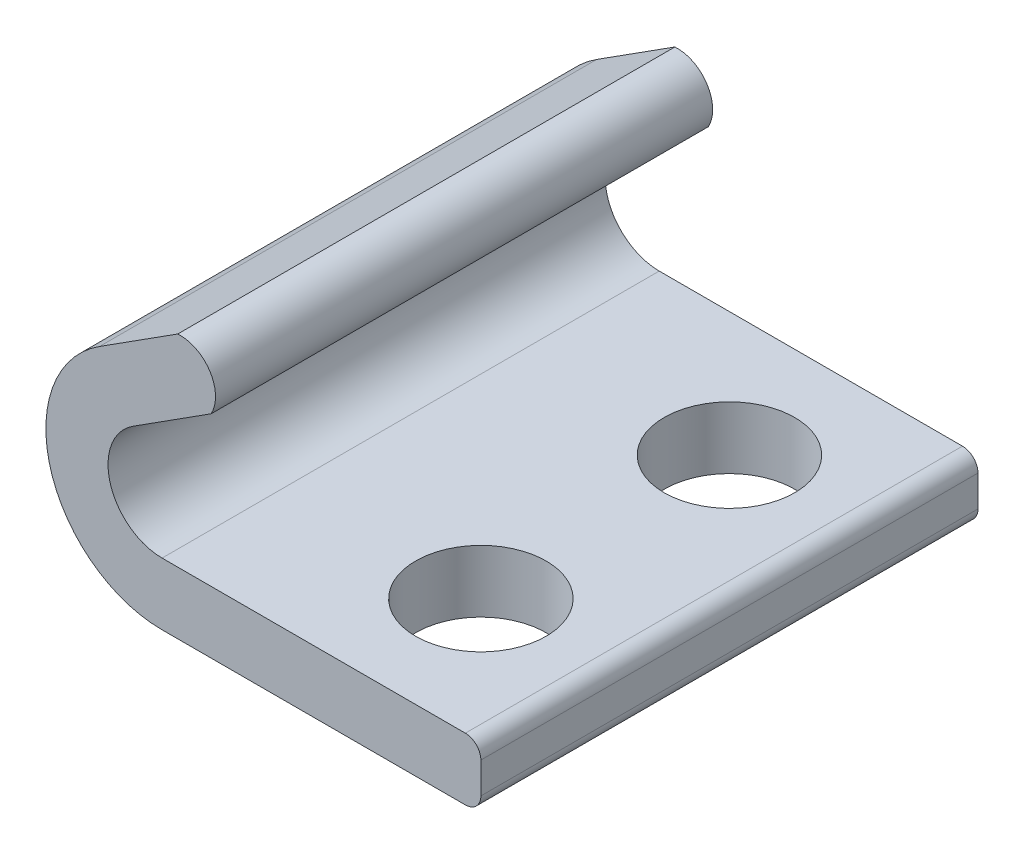
ISO-10303-21;
HEADER;
FILE_DESCRIPTION(('STEP AP214'),'2;1');
FILE_NAME('part.step','',(''),(''),'','','');
FILE_SCHEMA(('AUTOMOTIVE_DESIGN { 1 0 10303 214 1 1 1 1 }'));
ENDSEC;
DATA;
#1=APPLICATION_CONTEXT('core data for automotive mechanical design processes');
#2=APPLICATION_PROTOCOL_DEFINITION('international standard','automotive_design',2000,#1);
#3=PRODUCT_CONTEXT('',#1,'mechanical');
#4=PRODUCT('Part','Part','',(#3));
#5=PRODUCT_RELATED_PRODUCT_CATEGORY('part','',(#4));
#6=PRODUCT_DEFINITION_FORMATION('','',#4);
#7=PRODUCT_DEFINITION_CONTEXT('part definition',#1,'design');
#8=PRODUCT_DEFINITION('design','',#6,#7);
#9=PRODUCT_DEFINITION_SHAPE('','',#8);
#10=(LENGTH_UNIT() NAMED_UNIT(*) SI_UNIT(.MILLI.,.METRE.));
#11=(NAMED_UNIT(*) PLANE_ANGLE_UNIT() SI_UNIT($,.RADIAN.));
#12=(NAMED_UNIT(*) SI_UNIT($,.STERADIAN.) SOLID_ANGLE_UNIT());
#13=UNCERTAINTY_MEASURE_WITH_UNIT(LENGTH_MEASURE(1.E-05),#10,'distance_accuracy_value','');
#14=(GEOMETRIC_REPRESENTATION_CONTEXT(3) GLOBAL_UNCERTAINTY_ASSIGNED_CONTEXT((#13)) GLOBAL_UNIT_ASSIGNED_CONTEXT((#10,
#11,#12)) REPRESENTATION_CONTEXT('',''));
#15=CARTESIAN_POINT('',(0.,0.,0.));
#16=DIRECTION('',(0.,0.,1.));
#17=DIRECTION('',(1.,0.,0.));
#18=AXIS2_PLACEMENT_3D('',#15,#16,#17);
#19=CARTESIAN_POINT('',(-9.68,7.36,-8.));
#20=DIRECTION('',(0.,0.,1.));
#21=DIRECTION('',(1.,0.,0.));
#22=AXIS2_PLACEMENT_3D('',#19,#20,#21);
#23=CYLINDRICAL_SURFACE('',#22,1.14);
#24=CARTESIAN_POINT('',(-9.68,7.36,8.));
#25=DIRECTION('',(0.,0.,1.));
#26=DIRECTION('',(1.,0.,0.));
#27=AXIS2_PLACEMENT_3D('',#24,#25,#26);
#28=CIRCLE('',#27,1.14);
#29=CARTESIAN_POINT('',(-8.68073853739948,6.81129559017494,8.));
#30=VERTEX_POINT('',#29);
#31=CARTESIAN_POINT('',(-9.75633734516999,8.49744125550834,8.));
#32=VERTEX_POINT('',#31);
#33=EDGE_CURVE('E159',#30,#32,#28,.T.);
#34=ORIENTED_EDGE('',*,*,#33,.F.);
#35=DIRECTION('',(0.,0.,1.));
#36=VECTOR('',#35,1.);
#37=CARTESIAN_POINT('',(-8.68073853739948,6.81129559017494,-8.));
#38=LINE('',#37,#36);
#39=CARTESIAN_POINT('',(-8.68073853739948,6.81129559017494,-8.));
#40=VERTEX_POINT('',#39);
#41=EDGE_CURVE('E137',#40,#30,#38,.T.);
#42=ORIENTED_EDGE('',*,*,#41,.F.);
#43=CARTESIAN_POINT('',(-9.68,7.36,-8.));
#44=DIRECTION('',(0.,0.,1.));
#45=DIRECTION('',(1.,0.,0.));
#46=AXIS2_PLACEMENT_3D('',#43,#44,#45);
#47=CIRCLE('',#46,1.14);
#48=CARTESIAN_POINT('',(-9.75633734516999,8.49744125550834,-8.));
#49=VERTEX_POINT('',#48);
#50=EDGE_CURVE('E132',#40,#49,#47,.T.);
#51=ORIENTED_EDGE('',*,*,#50,.T.);
#52=DIRECTION('',(0.,0.,1.));
#53=VECTOR('',#52,1.);
#54=CARTESIAN_POINT('',(-9.75633734516999,8.49744125550834,-8.));
#55=LINE('',#54,#53);
#56=EDGE_CURVE('E115',#49,#32,#55,.T.);
#57=ORIENTED_EDGE('',*,*,#56,.T.);
#58=EDGE_LOOP('',(#34,#42,#51,#57));
#59=FACE_BOUND('',#58,.T.);
#60=ADVANCED_FACE('F35',(#59),#23,.T.);
#61=CARTESIAN_POINT('',(-11.1957709627604,5.20694672884006,-8.));
#62=DIRECTION('',(0.537799403885265,-0.8430728326667,0.));
#63=DIRECTION('',(0.8430728326667,0.537799403885265,0.));
#64=AXIS2_PLACEMENT_3D('',#61,#62,#63);
#65=PLANE('',#64);
#66=DIRECTION('',(0.8430728326667,0.537799403885265,0.));
#67=VECTOR('',#66,1.);
#68=CARTESIAN_POINT('',(-11.1957709627604,5.20694672884006,8.));
#69=LINE('',#68,#67);
#70=CARTESIAN_POINT('',(-11.1957709627604,5.20694672884006,8.));
#71=VERTEX_POINT('',#70);
#72=EDGE_CURVE('E138',#71,#30,#69,.T.);
#73=ORIENTED_EDGE('',*,*,#72,.F.);
#74=DIRECTION('',(0.,0.,1.));
#75=VECTOR('',#74,1.);
#76=CARTESIAN_POINT('',(-11.1957709627604,5.20694672884006,-8.));
#77=LINE('',#76,#75);
#78=CARTESIAN_POINT('',(-11.1957709627604,5.20694672884006,-8.));
#79=VERTEX_POINT('',#78);
#80=EDGE_CURVE('E177',#79,#71,#77,.T.);
#81=ORIENTED_EDGE('',*,*,#80,.F.);
#82=DIRECTION('',(0.8430728326667,0.537799403885265,0.));
#83=VECTOR('',#82,1.);
#84=CARTESIAN_POINT('',(-11.1957709627604,5.20694672884006,-8.));
#85=LINE('',#84,#83);
#86=EDGE_CURVE('E126',#79,#40,#85,.T.);
#87=ORIENTED_EDGE('',*,*,#86,.T.);
#88=ORIENTED_EDGE('',*,*,#41,.T.);
#89=EDGE_LOOP('',(#73,#81,#87,#88));
#90=FACE_BOUND('',#89,.T.);
#91=ADVANCED_FACE('F212',(#90),#65,.T.);
#92=CARTESIAN_POINT('',(-10.26,3.74,-8.));
#93=DIRECTION('',(0.,0.,1.));
#94=DIRECTION('',(1.,0.,0.));
#95=AXIS2_PLACEMENT_3D('',#92,#93,#94);
#96=CYLINDRICAL_SURFACE('',#95,1.74);
#97=CARTESIAN_POINT('',(-10.26,3.74,8.));
#98=DIRECTION('',(0.,0.,-1.));
#99=DIRECTION('',(-1.,0.,0.));
#100=AXIS2_PLACEMENT_3D('',#97,#98,#99);
#101=CIRCLE('',#100,1.74);
#102=CARTESIAN_POINT('',(-10.26,2.,8.));
#103=VERTEX_POINT('',#102);
#104=EDGE_CURVE('E141',#103,#71,#101,.T.);
#105=ORIENTED_EDGE('',*,*,#104,.F.);
#106=DIRECTION('',(0.,0.,1.));
#107=VECTOR('',#106,1.);
#108=CARTESIAN_POINT('',(-10.26,2.,-8.));
#109=LINE('',#108,#107);
#110=CARTESIAN_POINT('',(-10.26,2.,-8.));
#111=VERTEX_POINT('',#110);
#112=EDGE_CURVE('E179',#111,#103,#109,.T.);
#113=ORIENTED_EDGE('',*,*,#112,.F.);
#114=CARTESIAN_POINT('',(-10.26,3.74,-8.));
#115=DIRECTION('',(0.,0.,-1.));
#116=DIRECTION('',(-1.,0.,0.));
#117=AXIS2_PLACEMENT_3D('',#114,#115,#116);
#118=CIRCLE('',#117,1.74);
#119=EDGE_CURVE('E155',#111,#79,#118,.T.);
#120=ORIENTED_EDGE('',*,*,#119,.T.);
#121=ORIENTED_EDGE('',*,*,#80,.T.);
#122=EDGE_LOOP('',(#105,#113,#120,#121));
#123=FACE_BOUND('',#122,.T.);
#124=ADVANCED_FACE('F209',(#123),#96,.F.);
#125=CARTESIAN_POINT('',(0.,2.,-8.));
#126=DIRECTION('',(0.,1.,0.));
#127=DIRECTION('',(0.,0.,1.));
#128=AXIS2_PLACEMENT_3D('',#125,#126,#127);
#129=PLANE('',#128);
#130=CARTESIAN_POINT('',(-4.,2.,-4.));
#131=DIRECTION('',(0.,1.,0.));
#132=DIRECTION('',(0.,0.,1.));
#133=AXIS2_PLACEMENT_3D('',#130,#131,#132);
#134=CIRCLE('',#133,2.09999999999999);
#135=CARTESIAN_POINT('',(-4.,2.,-1.90000000000001));
#136=VERTEX_POINT('',#135);
#137=EDGE_CURVE('E265',#136,#136,#134,.T.);
#138=ORIENTED_EDGE('',*,*,#137,.F.);
#139=EDGE_LOOP('',(#138));
#140=FACE_BOUND('',#139,.T.);
#141=CARTESIAN_POINT('',(-4.,2.,4.));
#142=DIRECTION('',(0.,1.,0.));
#143=DIRECTION('',(0.,0.,1.));
#144=AXIS2_PLACEMENT_3D('',#141,#142,#143);
#145=CIRCLE('',#144,2.09999999999999);
#146=CARTESIAN_POINT('',(-4.,2.,6.09999999999999));
#147=VERTEX_POINT('',#146);
#148=EDGE_CURVE('E267',#147,#147,#145,.T.);
#149=ORIENTED_EDGE('',*,*,#148,.F.);
#150=EDGE_LOOP('',(#149));
#151=FACE_BOUND('',#150,.T.);
#152=DIRECTION('',(-1.,0.,0.));
#153=VECTOR('',#152,1.);
#154=CARTESIAN_POINT('',(0.,2.,8.));
#155=LINE('',#154,#153);
#156=CARTESIAN_POINT('',(-0.5,2.,8.));
#157=VERTEX_POINT('',#156);
#158=EDGE_CURVE('E171',#157,#103,#155,.T.);
#159=ORIENTED_EDGE('',*,*,#158,.F.);
#160=DIRECTION('',(0.,0.,1.));
#161=VECTOR('',#160,1.);
#162=CARTESIAN_POINT('',(-0.5,2.,-8.));
#163=LINE('',#162,#161);
#164=CARTESIAN_POINT('',(-0.5,2.,-8.));
#165=VERTEX_POINT('',#164);
#166=EDGE_CURVE('E58',#157,#165,#163,.F.);
#167=ORIENTED_EDGE('',*,*,#166,.T.);
#168=DIRECTION('',(-1.,0.,0.));
#169=VECTOR('',#168,1.);
#170=CARTESIAN_POINT('',(0.,2.,-8.));
#171=LINE('',#170,#169);
#172=EDGE_CURVE('E153',#165,#111,#171,.T.);
#173=ORIENTED_EDGE('',*,*,#172,.T.);
#174=ORIENTED_EDGE('',*,*,#112,.T.);
#175=EDGE_LOOP('',(#159,#167,#173,#174));
#176=FACE_BOUND('',#175,.T.);
#177=ADVANCED_FACE('F205',(#140,#151,#176),#129,.T.);
#178=CARTESIAN_POINT('',(0.,0.,-8.));
#179=DIRECTION('',(1.,0.,0.));
#180=DIRECTION('',(0.,0.,-1.));
#181=AXIS2_PLACEMENT_3D('',#178,#179,#180);
#182=PLANE('',#181);
#183=DIRECTION('',(0.,1.,0.));
#184=VECTOR('',#183,1.);
#185=CARTESIAN_POINT('',(0.,0.,-8.));
#186=LINE('',#185,#184);
#187=CARTESIAN_POINT('',(0.,0.5,-8.));
#188=VERTEX_POINT('',#187);
#189=CARTESIAN_POINT('',(0.,1.5,-8.));
#190=VERTEX_POINT('',#189);
#191=EDGE_CURVE('E150',#188,#190,#186,.T.);
#192=ORIENTED_EDGE('',*,*,#191,.T.);
#193=DIRECTION('',(0.,0.,1.));
#194=VECTOR('',#193,1.);
#195=CARTESIAN_POINT('',(0.,1.5,-8.));
#196=LINE('',#195,#194);
#197=CARTESIAN_POINT('',(0.,1.5,8.));
#198=VERTEX_POINT('',#197);
#199=EDGE_CURVE('E186',#190,#198,#196,.T.);
#200=ORIENTED_EDGE('',*,*,#199,.T.);
#201=DIRECTION('',(0.,1.,0.));
#202=VECTOR('',#201,1.);
#203=CARTESIAN_POINT('',(0.,0.,8.));
#204=LINE('',#203,#202);
#205=CARTESIAN_POINT('',(0.,0.5,8.));
#206=VERTEX_POINT('',#205);
#207=EDGE_CURVE('E168',#206,#198,#204,.T.);
#208=ORIENTED_EDGE('',*,*,#207,.F.);
#209=DIRECTION('',(0.,0.,1.));
#210=VECTOR('',#209,1.);
#211=CARTESIAN_POINT('',(0.,0.5,-8.));
#212=LINE('',#211,#210);
#213=EDGE_CURVE('E176',#206,#188,#212,.F.);
#214=ORIENTED_EDGE('',*,*,#213,.T.);
#215=EDGE_LOOP('',(#192,#200,#208,#214));
#216=FACE_BOUND('',#215,.T.);
#217=ADVANCED_FACE('F199',(#216),#182,.T.);
#218=CARTESIAN_POINT('',(-10.26,0.,-8.));
#219=DIRECTION('',(0.,-1.,0.));
#220=DIRECTION('',(1.,0.,0.));
#221=AXIS2_PLACEMENT_3D('',#218,#219,#220);
#222=PLANE('',#221);
#223=CARTESIAN_POINT('',(-4.,0.,-4.));
#224=DIRECTION('',(0.,1.,0.));
#225=DIRECTION('',(0.,0.,1.));
#226=AXIS2_PLACEMENT_3D('',#223,#224,#225);
#227=CIRCLE('',#226,2.09999999999999);
#228=CARTESIAN_POINT('',(-4.,0.,-1.90000000000001));
#229=VERTEX_POINT('',#228);
#230=EDGE_CURVE('E262',#229,#229,#227,.T.);
#231=ORIENTED_EDGE('',*,*,#230,.T.);
#232=EDGE_LOOP('',(#231));
#233=FACE_BOUND('',#232,.T.);
#234=CARTESIAN_POINT('',(-4.,0.,4.));
#235=DIRECTION('',(0.,1.,0.));
#236=DIRECTION('',(0.,0.,1.));
#237=AXIS2_PLACEMENT_3D('',#234,#235,#236);
#238=CIRCLE('',#237,2.09999999999999);
#239=CARTESIAN_POINT('',(-4.,0.,6.09999999999999));
#240=VERTEX_POINT('',#239);
#241=EDGE_CURVE('E144',#240,#240,#238,.T.);
#242=ORIENTED_EDGE('',*,*,#241,.T.);
#243=EDGE_LOOP('',(#242));
#244=FACE_BOUND('',#243,.T.);
#245=DIRECTION('',(1.,0.,0.));
#246=VECTOR('',#245,1.);
#247=CARTESIAN_POINT('',(-10.26,0.,-8.));
#248=LINE('',#247,#246);
#249=CARTESIAN_POINT('',(-10.26,0.,-8.));
#250=VERTEX_POINT('',#249);
#251=CARTESIAN_POINT('',(-0.5,0.,-8.));
#252=VERTEX_POINT('',#251);
#253=EDGE_CURVE('E148',#250,#252,#248,.T.);
#254=ORIENTED_EDGE('',*,*,#253,.T.);
#255=DIRECTION('',(0.,0.,1.));
#256=VECTOR('',#255,1.);
#257=CARTESIAN_POINT('',(-0.5,0.,-8.));
#258=LINE('',#257,#256);
#259=CARTESIAN_POINT('',(-0.5,0.,8.));
#260=VERTEX_POINT('',#259);
#261=EDGE_CURVE('E11',#252,#260,#258,.T.);
#262=ORIENTED_EDGE('',*,*,#261,.T.);
#263=DIRECTION('',(1.,0.,0.));
#264=VECTOR('',#263,1.);
#265=CARTESIAN_POINT('',(-10.26,0.,8.));
#266=LINE('',#265,#264);
#267=CARTESIAN_POINT('',(-10.26,0.,8.));
#268=VERTEX_POINT('',#267);
#269=EDGE_CURVE('E165',#268,#260,#266,.T.);
#270=ORIENTED_EDGE('',*,*,#269,.F.);
#271=DIRECTION('',(0.,0.,1.));
#272=VECTOR('',#271,1.);
#273=CARTESIAN_POINT('',(-10.26,0.,-8.));
#274=LINE('',#273,#272);
#275=EDGE_CURVE('E182',#250,#268,#274,.T.);
#276=ORIENTED_EDGE('',*,*,#275,.F.);
#277=EDGE_LOOP('',(#254,#262,#270,#276));
#278=FACE_BOUND('',#277,.T.);
#279=ADVANCED_FACE('F218',(#233,#244,#278),#222,.T.);
#280=CARTESIAN_POINT('',(-10.26,3.74,-8.));
#281=DIRECTION('',(0.,0.,1.));
#282=DIRECTION('',(1.,0.,0.));
#283=AXIS2_PLACEMENT_3D('',#280,#281,#282);
#284=CYLINDRICAL_SURFACE('',#283,3.74);
#285=CARTESIAN_POINT('',(-10.26,3.74,8.));
#286=DIRECTION('',(0.,0.,1.));
#287=DIRECTION('',(1.,0.,0.));
#288=AXIS2_PLACEMENT_3D('',#285,#286,#287);
#289=CIRCLE('',#288,3.74);
#290=CARTESIAN_POINT('',(-12.2713697705309,6.89309239417346,8.));
#291=VERTEX_POINT('',#290);
#292=EDGE_CURVE('E162',#291,#268,#289,.T.);
#293=ORIENTED_EDGE('',*,*,#292,.F.);
#294=DIRECTION('',(0.,0.,1.));
#295=VECTOR('',#294,1.);
#296=CARTESIAN_POINT('',(-12.2713697705309,6.89309239417346,-8.));
#297=LINE('',#296,#295);
#298=CARTESIAN_POINT('',(-12.2713697705309,6.89309239417346,-8.));
#299=VERTEX_POINT('',#298);
#300=EDGE_CURVE('E125',#299,#291,#297,.T.);
#301=ORIENTED_EDGE('',*,*,#300,.F.);
#302=CARTESIAN_POINT('',(-10.26,3.74,-8.));
#303=DIRECTION('',(0.,0.,1.));
#304=DIRECTION('',(1.,0.,0.));
#305=AXIS2_PLACEMENT_3D('',#302,#303,#304);
#306=CIRCLE('',#305,3.74);
#307=EDGE_CURVE('E135',#299,#250,#306,.T.);
#308=ORIENTED_EDGE('',*,*,#307,.T.);
#309=ORIENTED_EDGE('',*,*,#275,.T.);
#310=EDGE_LOOP('',(#293,#301,#308,#309));
#311=FACE_BOUND('',#310,.T.);
#312=ADVANCED_FACE('F216',(#311),#284,.T.);
#313=CARTESIAN_POINT('',(-9.75633734516999,8.49744125550834,-8.));
#314=DIRECTION('',(-0.537799403885262,0.843072832666702,0.));
#315=DIRECTION('',(-0.843072832666702,-0.537799403885262,0.));
#316=AXIS2_PLACEMENT_3D('',#313,#314,#315);
#317=PLANE('',#316);
#318=DIRECTION('',(-0.843072832666702,-0.537799403885262,0.));
#319=VECTOR('',#318,1.);
#320=CARTESIAN_POINT('',(-9.75633734516999,8.49744125550834,8.));
#321=LINE('',#320,#319);
#322=EDGE_CURVE('E120',#32,#291,#321,.T.);
#323=ORIENTED_EDGE('',*,*,#322,.F.);
#324=ORIENTED_EDGE('',*,*,#56,.F.);
#325=DIRECTION('',(-0.843072832666702,-0.537799403885262,0.));
#326=VECTOR('',#325,1.);
#327=CARTESIAN_POINT('',(-9.75633734516999,8.49744125550834,-8.));
#328=LINE('',#327,#326);
#329=EDGE_CURVE('E118',#49,#299,#328,.T.);
#330=ORIENTED_EDGE('',*,*,#329,.T.);
#331=ORIENTED_EDGE('',*,*,#300,.T.);
#332=EDGE_LOOP('',(#323,#324,#330,#331));
#333=FACE_BOUND('',#332,.T.);
#334=ADVANCED_FACE('F117',(#333),#317,.T.);
#335=CARTESIAN_POINT('',(-9.68,7.36,-8.));
#336=DIRECTION('',(0.,0.,1.));
#337=DIRECTION('',(1.,0.,0.));
#338=AXIS2_PLACEMENT_3D('',#335,#336,#337);
#339=PLANE('',#338);
#340=ORIENTED_EDGE('',*,*,#172,.F.);
#341=CARTESIAN_POINT('',(-0.5,1.5,-8.));
#342=DIRECTION('',(0.,0.,1.));
#343=DIRECTION('',(1.,0.,0.));
#344=AXIS2_PLACEMENT_3D('',#341,#342,#343);
#345=CIRCLE('',#344,0.5);
#346=EDGE_CURVE('E43',#165,#190,#345,.F.);
#347=ORIENTED_EDGE('',*,*,#346,.T.);
#348=ORIENTED_EDGE('',*,*,#191,.F.);
#349=CARTESIAN_POINT('',(-0.5,0.5,-8.));
#350=DIRECTION('',(0.,0.,1.));
#351=DIRECTION('',(1.,0.,0.));
#352=AXIS2_PLACEMENT_3D('',#349,#350,#351);
#353=CIRCLE('',#352,0.5);
#354=EDGE_CURVE('E50',#188,#252,#353,.F.);
#355=ORIENTED_EDGE('',*,*,#354,.T.);
#356=ORIENTED_EDGE('',*,*,#253,.F.);
#357=ORIENTED_EDGE('',*,*,#307,.F.);
#358=ORIENTED_EDGE('',*,*,#329,.F.);
#359=ORIENTED_EDGE('',*,*,#50,.F.);
#360=ORIENTED_EDGE('',*,*,#86,.F.);
#361=ORIENTED_EDGE('',*,*,#119,.F.);
#362=EDGE_LOOP('',(#340,#347,#348,#355,#356,#357,#358,#359,#360,#361));
#363=FACE_BOUND('',#362,.T.);
#364=ADVANCED_FACE('F130',(#363),#339,.F.);
#365=CARTESIAN_POINT('',(-9.68,7.36,8.));
#366=DIRECTION('',(0.,0.,1.));
#367=DIRECTION('',(1.,0.,0.));
#368=AXIS2_PLACEMENT_3D('',#365,#366,#367);
#369=PLANE('',#368);
#370=ORIENTED_EDGE('',*,*,#207,.T.);
#371=CARTESIAN_POINT('',(-0.5,1.5,8.));
#372=DIRECTION('',(0.,0.,1.));
#373=DIRECTION('',(1.,0.,0.));
#374=AXIS2_PLACEMENT_3D('',#371,#372,#373);
#375=CIRCLE('',#374,0.5);
#376=EDGE_CURVE('E191',#198,#157,#375,.T.);
#377=ORIENTED_EDGE('',*,*,#376,.T.);
#378=ORIENTED_EDGE('',*,*,#158,.T.);
#379=ORIENTED_EDGE('',*,*,#104,.T.);
#380=ORIENTED_EDGE('',*,*,#72,.T.);
#381=ORIENTED_EDGE('',*,*,#33,.T.);
#382=ORIENTED_EDGE('',*,*,#322,.T.);
#383=ORIENTED_EDGE('',*,*,#292,.T.);
#384=ORIENTED_EDGE('',*,*,#269,.T.);
#385=CARTESIAN_POINT('',(-0.5,0.5,8.));
#386=DIRECTION('',(0.,0.,1.));
#387=DIRECTION('',(1.,0.,0.));
#388=AXIS2_PLACEMENT_3D('',#385,#386,#387);
#389=CIRCLE('',#388,0.5);
#390=EDGE_CURVE('E189',#260,#206,#389,.T.);
#391=ORIENTED_EDGE('',*,*,#390,.T.);
#392=EDGE_LOOP('',(#370,#377,#378,#379,#380,#381,#382,#383,#384,#391));
#393=FACE_BOUND('',#392,.T.);
#394=ADVANCED_FACE('F204',(#393),#369,.T.);
#395=CARTESIAN_POINT('',(-4.,2.,4.));
#396=DIRECTION('',(0.,1.,0.));
#397=DIRECTION('',(0.,0.,1.));
#398=AXIS2_PLACEMENT_3D('',#395,#396,#397);
#399=CYLINDRICAL_SURFACE('',#398,2.09999999999999);
#400=ORIENTED_EDGE('',*,*,#241,.F.);
#401=EDGE_LOOP('',(#400));
#402=FACE_BOUND('',#401,.T.);
#403=ORIENTED_EDGE('',*,*,#148,.T.);
#404=EDGE_LOOP('',(#403));
#405=FACE_BOUND('',#404,.T.);
#406=ADVANCED_FACE('F249',(#402,#405),#399,.F.);
#407=CARTESIAN_POINT('',(-4.,2.,-4.));
#408=DIRECTION('',(0.,1.,0.));
#409=DIRECTION('',(0.,0.,1.));
#410=AXIS2_PLACEMENT_3D('',#407,#408,#409);
#411=CYLINDRICAL_SURFACE('',#410,2.09999999999999);
#412=ORIENTED_EDGE('',*,*,#230,.F.);
#413=EDGE_LOOP('',(#412));
#414=FACE_BOUND('',#413,.T.);
#415=ORIENTED_EDGE('',*,*,#137,.T.);
#416=EDGE_LOOP('',(#415));
#417=FACE_BOUND('',#416,.T.);
#418=ADVANCED_FACE('F225',(#414,#417),#411,.F.);
#419=CARTESIAN_POINT('',(-0.5,1.5,-8.));
#420=DIRECTION('',(0.,0.,1.));
#421=DIRECTION('',(1.,0.,0.));
#422=AXIS2_PLACEMENT_3D('',#419,#420,#421);
#423=CYLINDRICAL_SURFACE('',#422,0.5);
#424=ORIENTED_EDGE('',*,*,#346,.F.);
#425=ORIENTED_EDGE('',*,*,#166,.F.);
#426=ORIENTED_EDGE('',*,*,#376,.F.);
#427=ORIENTED_EDGE('',*,*,#199,.F.);
#428=EDGE_LOOP('',(#424,#425,#426,#427));
#429=FACE_BOUND('',#428,.T.);
#430=ADVANCED_FACE('F202',(#429),#423,.T.);
#431=CARTESIAN_POINT('',(-0.5,0.5,-8.));
#432=DIRECTION('',(0.,0.,1.));
#433=DIRECTION('',(1.,0.,0.));
#434=AXIS2_PLACEMENT_3D('',#431,#432,#433);
#435=CYLINDRICAL_SURFACE('',#434,0.5);
#436=ORIENTED_EDGE('',*,*,#354,.F.);
#437=ORIENTED_EDGE('',*,*,#213,.F.);
#438=ORIENTED_EDGE('',*,*,#390,.F.);
#439=ORIENTED_EDGE('',*,*,#261,.F.);
#440=EDGE_LOOP('',(#436,#437,#438,#439));
#441=FACE_BOUND('',#440,.T.);
#442=ADVANCED_FACE('F37',(#441),#435,.T.);
#443=CLOSED_SHELL('',(#60,#91,#124,#177,#217,#279,#312,#334,#364,#394,#406,#418,#430,#442));
#444=MANIFOLD_SOLID_BREP('B2',#443);
#445=ADVANCED_BREP_SHAPE_REPRESENTATION('',(#18,#444),#14);
#446=SHAPE_DEFINITION_REPRESENTATION(#9,#445);
ENDSEC;
END-ISO-10303-21;
